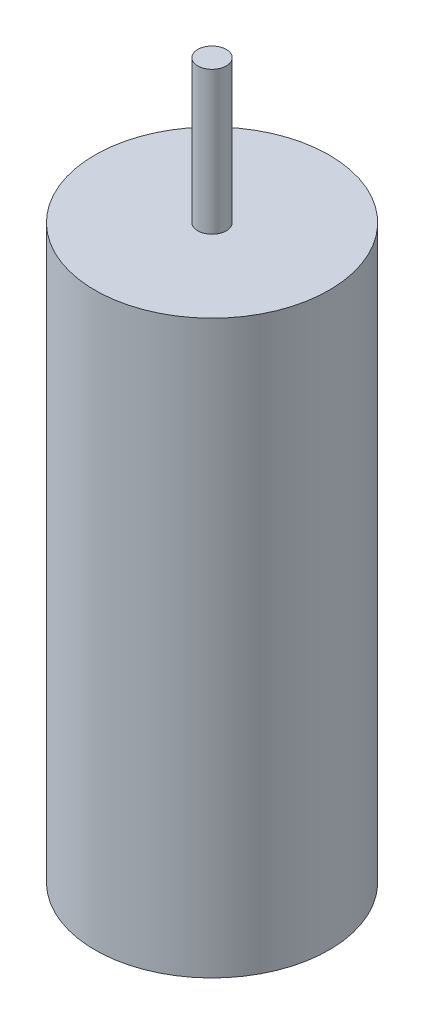
ISO-10303-21;
HEADER;
FILE_DESCRIPTION(('STEP AP214'),'2;1');
FILE_NAME('part.step','',(''),(''),'','','');
FILE_SCHEMA(('AUTOMOTIVE_DESIGN { 1 0 10303 214 1 1 1 1 }'));
ENDSEC;
DATA;
#1=APPLICATION_CONTEXT('core data for automotive mechanical design processes');
#2=APPLICATION_PROTOCOL_DEFINITION('international standard','automotive_design',2000,#1);
#3=PRODUCT_CONTEXT('',#1,'mechanical');
#4=PRODUCT('Part','Part','',(#3));
#5=PRODUCT_RELATED_PRODUCT_CATEGORY('part','',(#4));
#6=PRODUCT_DEFINITION_FORMATION('','',#4);
#7=PRODUCT_DEFINITION_CONTEXT('part definition',#1,'design');
#8=PRODUCT_DEFINITION('design','',#6,#7);
#9=PRODUCT_DEFINITION_SHAPE('','',#8);
#10=(LENGTH_UNIT() NAMED_UNIT(*) SI_UNIT(.MILLI.,.METRE.));
#11=(NAMED_UNIT(*) PLANE_ANGLE_UNIT() SI_UNIT($,.RADIAN.));
#12=(NAMED_UNIT(*) SI_UNIT($,.STERADIAN.) SOLID_ANGLE_UNIT());
#13=UNCERTAINTY_MEASURE_WITH_UNIT(LENGTH_MEASURE(1.E-05),#10,'distance_accuracy_value','');
#14=(GEOMETRIC_REPRESENTATION_CONTEXT(3) GLOBAL_UNCERTAINTY_ASSIGNED_CONTEXT((#13)) GLOBAL_UNIT_ASSIGNED_CONTEXT((#10,
#11,#12)) REPRESENTATION_CONTEXT('',''));
#15=CARTESIAN_POINT('',(0.,0.,0.));
#16=DIRECTION('',(0.,0.,1.));
#17=DIRECTION('',(1.,0.,0.));
#18=AXIS2_PLACEMENT_3D('',#15,#16,#17);
#19=CARTESIAN_POINT('',(0.,25.,0.));
#20=DIRECTION('',(0.,1.,0.));
#21=DIRECTION('',(0.,0.,1.));
#22=AXIS2_PLACEMENT_3D('',#19,#20,#21);
#23=PLANE('',#22);
#24=CARTESIAN_POINT('',(0.,25.,0.));
#25=DIRECTION('',(0.,-1.,0.));
#26=DIRECTION('',(0.,0.,-1.));
#27=AXIS2_PLACEMENT_3D('',#24,#25,#26);
#28=CIRCLE('',#27,0.5);
#29=CARTESIAN_POINT('',(0.,25.,-0.5));
#30=VERTEX_POINT('',#29);
#31=EDGE_CURVE('E10',#30,#30,#28,.T.);
#32=ORIENTED_EDGE('',*,*,#31,.F.);
#33=EDGE_LOOP('',(#32));
#34=FACE_BOUND('',#33,.T.);
#35=ADVANCED_FACE('F30',(#34),#23,.T.);
#36=CARTESIAN_POINT('',(0.,0.,0.));
#37=DIRECTION('',(0.,-1.,0.));
#38=DIRECTION('',(0.,0.,-1.));
#39=AXIS2_PLACEMENT_3D('',#36,#37,#38);
#40=CYLINDRICAL_SURFACE('',#39,0.499999999999999);
#41=ORIENTED_EDGE('',*,*,#31,.T.);
#42=EDGE_LOOP('',(#41));
#43=FACE_BOUND('',#42,.T.);
#44=CARTESIAN_POINT('',(0.,20.,0.));
#45=DIRECTION('',(0.,-1.,0.));
#46=DIRECTION('',(0.,0.,-1.));
#47=AXIS2_PLACEMENT_3D('',#44,#45,#46);
#48=CIRCLE('',#47,0.499999999999998);
#49=CARTESIAN_POINT('',(0.,20.,-0.499999999999998));
#50=VERTEX_POINT('',#49);
#51=EDGE_CURVE('E36',#50,#50,#48,.T.);
#52=ORIENTED_EDGE('',*,*,#51,.F.);
#53=EDGE_LOOP('',(#52));
#54=FACE_BOUND('',#53,.T.);
#55=ADVANCED_FACE('F62',(#43,#54),#40,.T.);
#56=CARTESIAN_POINT('',(0.499999999999998,20.,0.));
#57=DIRECTION('',(0.,1.,0.));
#58=DIRECTION('',(0.,0.,1.));
#59=AXIS2_PLACEMENT_3D('',#56,#57,#58);
#60=PLANE('',#59);
#61=ORIENTED_EDGE('',*,*,#51,.T.);
#62=EDGE_LOOP('',(#61));
#63=FACE_BOUND('',#62,.T.);
#64=CARTESIAN_POINT('',(0.,20.,0.));
#65=DIRECTION('',(0.,-1.,0.));
#66=DIRECTION('',(0.,0.,-1.));
#67=AXIS2_PLACEMENT_3D('',#64,#65,#66);
#68=CIRCLE('',#67,4.1);
#69=CARTESIAN_POINT('',(0.,20.,-4.1));
#70=VERTEX_POINT('',#69);
#71=EDGE_CURVE('E40',#70,#70,#68,.T.);
#72=ORIENTED_EDGE('',*,*,#71,.F.);
#73=EDGE_LOOP('',(#72));
#74=FACE_BOUND('',#73,.T.);
#75=ADVANCED_FACE('F54',(#63,#74),#60,.T.);
#76=CARTESIAN_POINT('',(0.,0.,0.));
#77=DIRECTION('',(0.,-1.,0.));
#78=DIRECTION('',(0.,0.,-1.));
#79=AXIS2_PLACEMENT_3D('',#76,#77,#78);
#80=CYLINDRICAL_SURFACE('',#79,4.1);
#81=ORIENTED_EDGE('',*,*,#71,.T.);
#82=EDGE_LOOP('',(#81));
#83=FACE_BOUND('',#82,.T.);
#84=CARTESIAN_POINT('',(0.,0.,0.));
#85=DIRECTION('',(0.,-1.,0.));
#86=DIRECTION('',(0.,0.,-1.));
#87=AXIS2_PLACEMENT_3D('',#84,#85,#86);
#88=CIRCLE('',#87,4.1);
#89=CARTESIAN_POINT('',(0.,0.,-4.1));
#90=VERTEX_POINT('',#89);
#91=EDGE_CURVE('E44',#90,#90,#88,.T.);
#92=ORIENTED_EDGE('',*,*,#91,.F.);
#93=EDGE_LOOP('',(#92));
#94=FACE_BOUND('',#93,.T.);
#95=ADVANCED_FACE('F52',(#83,#94),#80,.T.);
#96=CARTESIAN_POINT('',(4.1,0.,0.));
#97=DIRECTION('',(0.,-1.,0.));
#98=DIRECTION('',(0.,0.,-1.));
#99=AXIS2_PLACEMENT_3D('',#96,#97,#98);
#100=PLANE('',#99);
#101=ORIENTED_EDGE('',*,*,#91,.T.);
#102=EDGE_LOOP('',(#101));
#103=FACE_BOUND('',#102,.T.);
#104=ADVANCED_FACE('F50',(#103),#100,.T.);
#105=CLOSED_SHELL('',(#35,#55,#75,#95,#104));
#106=MANIFOLD_SOLID_BREP('B2',#105);
#107=ADVANCED_BREP_SHAPE_REPRESENTATION('',(#18,#106),#14);
#108=SHAPE_DEFINITION_REPRESENTATION(#9,#107);
ENDSEC;
END-ISO-10303-21;
